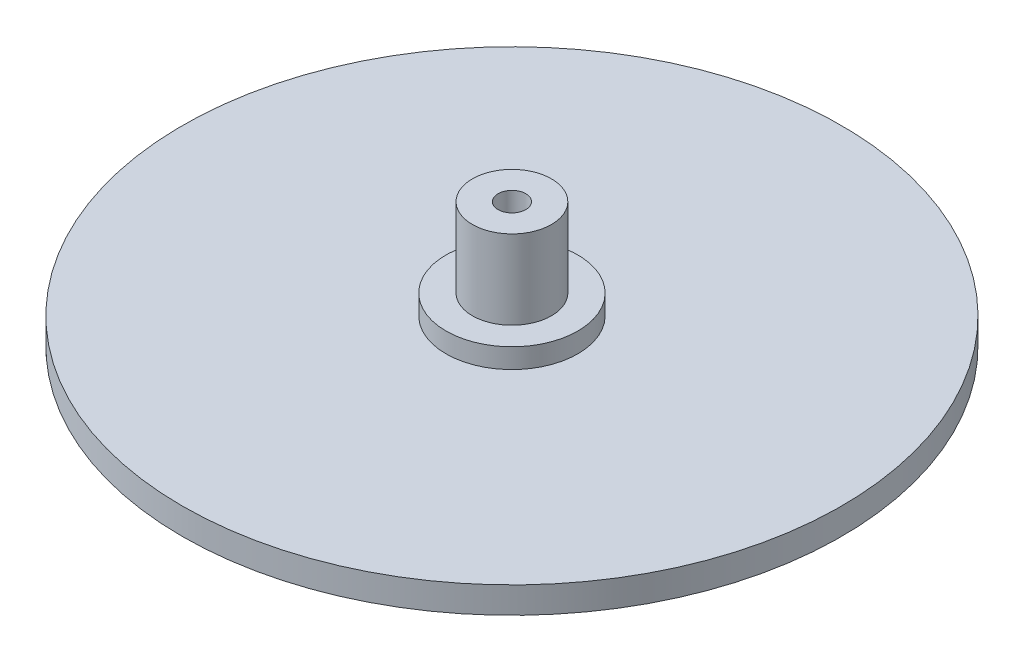
ISO-10303-21;
HEADER;
FILE_DESCRIPTION(('STEP AP214'),'2;1');
FILE_NAME('part.step','',(''),(''),'','','');
FILE_SCHEMA(('AUTOMOTIVE_DESIGN { 1 0 10303 214 1 1 1 1 }'));
ENDSEC;
DATA;
#1=APPLICATION_CONTEXT('core data for automotive mechanical design processes');
#2=APPLICATION_PROTOCOL_DEFINITION('international standard','automotive_design',2000,#1);
#3=PRODUCT_CONTEXT('',#1,'mechanical');
#4=PRODUCT('Part','Part','',(#3));
#5=PRODUCT_RELATED_PRODUCT_CATEGORY('part','',(#4));
#6=PRODUCT_DEFINITION_FORMATION('','',#4);
#7=PRODUCT_DEFINITION_CONTEXT('part definition',#1,'design');
#8=PRODUCT_DEFINITION('design','',#6,#7);
#9=PRODUCT_DEFINITION_SHAPE('','',#8);
#10=(LENGTH_UNIT() NAMED_UNIT(*) SI_UNIT(.MILLI.,.METRE.));
#11=(NAMED_UNIT(*) PLANE_ANGLE_UNIT() SI_UNIT($,.RADIAN.));
#12=(NAMED_UNIT(*) SI_UNIT($,.STERADIAN.) SOLID_ANGLE_UNIT());
#13=UNCERTAINTY_MEASURE_WITH_UNIT(LENGTH_MEASURE(1.E-05),#10,'distance_accuracy_value','');
#14=(GEOMETRIC_REPRESENTATION_CONTEXT(3) GLOBAL_UNCERTAINTY_ASSIGNED_CONTEXT((#13)) GLOBAL_UNIT_ASSIGNED_CONTEXT((#10,
#11,#12)) REPRESENTATION_CONTEXT('',''));
#15=CARTESIAN_POINT('',(0.,0.,0.));
#16=DIRECTION('',(0.,0.,1.));
#17=DIRECTION('',(1.,0.,0.));
#18=AXIS2_PLACEMENT_3D('',#15,#16,#17);
#19=CARTESIAN_POINT('',(0.,2.,0.));
#20=DIRECTION('',(0.,-1.,0.));
#21=DIRECTION('',(0.,0.,-1.));
#22=AXIS2_PLACEMENT_3D('',#19,#20,#21);
#23=CYLINDRICAL_SURFACE('',#22,25.);
#24=CARTESIAN_POINT('',(0.,2.,0.));
#25=DIRECTION('',(0.,1.,0.));
#26=DIRECTION('',(0.,0.,1.));
#27=AXIS2_PLACEMENT_3D('',#24,#25,#26);
#28=CIRCLE('',#27,25.);
#29=CARTESIAN_POINT('',(0.,2.,25.));
#30=VERTEX_POINT('',#29);
#31=EDGE_CURVE('E60',#30,#30,#28,.T.);
#32=ORIENTED_EDGE('',*,*,#31,.F.);
#33=EDGE_LOOP('',(#32));
#34=FACE_BOUND('',#33,.T.);
#35=CARTESIAN_POINT('',(0.,0.,0.));
#36=DIRECTION('',(0.,1.,0.));
#37=DIRECTION('',(0.,0.,1.));
#38=AXIS2_PLACEMENT_3D('',#35,#36,#37);
#39=CIRCLE('',#38,25.);
#40=CARTESIAN_POINT('',(0.,0.,25.));
#41=VERTEX_POINT('',#40);
#42=EDGE_CURVE('E46',#41,#41,#39,.T.);
#43=ORIENTED_EDGE('',*,*,#42,.T.);
#44=EDGE_LOOP('',(#43));
#45=FACE_BOUND('',#44,.T.);
#46=ADVANCED_FACE('F43',(#34,#45),#23,.T.);
#47=CARTESIAN_POINT('',(0.,2.,0.));
#48=DIRECTION('',(0.,1.,0.));
#49=DIRECTION('',(0.,0.,1.));
#50=AXIS2_PLACEMENT_3D('',#47,#48,#49);
#51=PLANE('',#50);
#52=CARTESIAN_POINT('',(0.,2.,0.));
#53=DIRECTION('',(0.,1.,0.));
#54=DIRECTION('',(0.,0.,1.));
#55=AXIS2_PLACEMENT_3D('',#52,#53,#54);
#56=CIRCLE('',#55,5.);
#57=CARTESIAN_POINT('',(0.,2.,5.));
#58=VERTEX_POINT('',#57);
#59=EDGE_CURVE('E51',#58,#58,#56,.T.);
#60=ORIENTED_EDGE('',*,*,#59,.F.);
#61=EDGE_LOOP('',(#60));
#62=FACE_BOUND('',#61,.T.);
#63=ORIENTED_EDGE('',*,*,#31,.T.);
#64=EDGE_LOOP('',(#63));
#65=FACE_BOUND('',#64,.T.);
#66=ADVANCED_FACE('F76',(#62,#65),#51,.T.);
#67=CARTESIAN_POINT('',(0.,0.,0.));
#68=DIRECTION('',(0.,1.,0.));
#69=DIRECTION('',(0.,0.,1.));
#70=AXIS2_PLACEMENT_3D('',#67,#68,#69);
#71=PLANE('',#70);
#72=ORIENTED_EDGE('',*,*,#42,.F.);
#73=EDGE_LOOP('',(#72));
#74=FACE_BOUND('',#73,.T.);
#75=ADVANCED_FACE('F73',(#74),#71,.F.);
#76=CARTESIAN_POINT('',(0.,3.5,0.));
#77=DIRECTION('',(0.,-1.,0.));
#78=DIRECTION('',(0.,0.,-1.));
#79=AXIS2_PLACEMENT_3D('',#76,#77,#78);
#80=CYLINDRICAL_SURFACE('',#79,5.);
#81=CARTESIAN_POINT('',(0.,3.5,0.));
#82=DIRECTION('',(0.,1.,0.));
#83=DIRECTION('',(0.,0.,1.));
#84=AXIS2_PLACEMENT_3D('',#81,#82,#83);
#85=CIRCLE('',#84,5.);
#86=CARTESIAN_POINT('',(0.,3.5,5.));
#87=VERTEX_POINT('',#86);
#88=EDGE_CURVE('E61',#87,#87,#85,.T.);
#89=ORIENTED_EDGE('',*,*,#88,.F.);
#90=EDGE_LOOP('',(#89));
#91=FACE_BOUND('',#90,.T.);
#92=ORIENTED_EDGE('',*,*,#59,.T.);
#93=EDGE_LOOP('',(#92));
#94=FACE_BOUND('',#93,.T.);
#95=ADVANCED_FACE('F80',(#91,#94),#80,.T.);
#96=CARTESIAN_POINT('',(0.,3.5,0.));
#97=DIRECTION('',(0.,1.,0.));
#98=DIRECTION('',(0.,0.,1.));
#99=AXIS2_PLACEMENT_3D('',#96,#97,#98);
#100=PLANE('',#99);
#101=CARTESIAN_POINT('',(0.,3.5,0.));
#102=DIRECTION('',(0.,1.,0.));
#103=DIRECTION('',(0.,0.,1.));
#104=AXIS2_PLACEMENT_3D('',#101,#102,#103);
#105=CIRCLE('',#104,3.);
#106=CARTESIAN_POINT('',(0.,3.5,3.));
#107=VERTEX_POINT('',#106);
#108=EDGE_CURVE('E10',#107,#107,#105,.T.);
#109=ORIENTED_EDGE('',*,*,#108,.F.);
#110=EDGE_LOOP('',(#109));
#111=FACE_BOUND('',#110,.T.);
#112=ORIENTED_EDGE('',*,*,#88,.T.);
#113=EDGE_LOOP('',(#112));
#114=FACE_BOUND('',#113,.T.);
#115=ADVANCED_FACE('F81',(#111,#114),#100,.T.);
#116=CARTESIAN_POINT('',(0.,9.5,0.));
#117=DIRECTION('',(0.,-1.,0.));
#118=DIRECTION('',(0.,0.,-1.));
#119=AXIS2_PLACEMENT_3D('',#116,#117,#118);
#120=CYLINDRICAL_SURFACE('',#119,3.);
#121=CARTESIAN_POINT('',(0.,9.5,0.));
#122=DIRECTION('',(0.,1.,0.));
#123=DIRECTION('',(0.,0.,1.));
#124=AXIS2_PLACEMENT_3D('',#121,#122,#123);
#125=CIRCLE('',#124,3.);
#126=CARTESIAN_POINT('',(0.,9.5,3.));
#127=VERTEX_POINT('',#126);
#128=EDGE_CURVE('E63',#127,#127,#125,.T.);
#129=ORIENTED_EDGE('',*,*,#128,.F.);
#130=EDGE_LOOP('',(#129));
#131=FACE_BOUND('',#130,.T.);
#132=ORIENTED_EDGE('',*,*,#108,.T.);
#133=EDGE_LOOP('',(#132));
#134=FACE_BOUND('',#133,.T.);
#135=ADVANCED_FACE('F116',(#131,#134),#120,.T.);
#136=CARTESIAN_POINT('',(0.,9.5,0.));
#137=DIRECTION('',(0.,1.,0.));
#138=DIRECTION('',(0.,0.,1.));
#139=AXIS2_PLACEMENT_3D('',#136,#137,#138);
#140=PLANE('',#139);
#141=CARTESIAN_POINT('',(0.,9.5,0.));
#142=DIRECTION('',(0.,1.,0.));
#143=DIRECTION('',(0.,0.,1.));
#144=AXIS2_PLACEMENT_3D('',#141,#142,#143);
#145=CIRCLE('',#144,1.05);
#146=CARTESIAN_POINT('',(0.,9.5,1.05));
#147=VERTEX_POINT('',#146);
#148=EDGE_CURVE('E164',#147,#147,#145,.T.);
#149=ORIENTED_EDGE('',*,*,#148,.F.);
#150=EDGE_LOOP('',(#149));
#151=FACE_BOUND('',#150,.T.);
#152=ORIENTED_EDGE('',*,*,#128,.T.);
#153=EDGE_LOOP('',(#152));
#154=FACE_BOUND('',#153,.T.);
#155=ADVANCED_FACE('F126',(#151,#154),#140,.T.);
#156=CARTESIAN_POINT('',(0.,0.5,0.));
#157=DIRECTION('',(0.,1.,0.));
#158=DIRECTION('',(0.,0.,1.));
#159=AXIS2_PLACEMENT_3D('',#156,#157,#158);
#160=CYLINDRICAL_SURFACE('',#159,1.05);
#161=CARTESIAN_POINT('',(0.,0.5,0.));
#162=DIRECTION('',(0.,1.,0.));
#163=DIRECTION('',(0.,0.,1.));
#164=AXIS2_PLACEMENT_3D('',#161,#162,#163);
#165=CIRCLE('',#164,1.05);
#166=CARTESIAN_POINT('',(0.,0.5,1.05));
#167=VERTEX_POINT('',#166);
#168=EDGE_CURVE('E162',#167,#167,#165,.T.);
#169=ORIENTED_EDGE('',*,*,#168,.F.);
#170=EDGE_LOOP('',(#169));
#171=FACE_BOUND('',#170,.T.);
#172=ORIENTED_EDGE('',*,*,#148,.T.);
#173=EDGE_LOOP('',(#172));
#174=FACE_BOUND('',#173,.T.);
#175=ADVANCED_FACE('F139',(#171,#174),#160,.F.);
#176=CARTESIAN_POINT('',(0.,0.5,0.));
#177=DIRECTION('',(0.,1.,0.));
#178=DIRECTION('',(0.,0.,1.));
#179=AXIS2_PLACEMENT_3D('',#176,#177,#178);
#180=PLANE('',#179);
#181=ORIENTED_EDGE('',*,*,#168,.T.);
#182=EDGE_LOOP('',(#181));
#183=FACE_BOUND('',#182,.T.);
#184=ADVANCED_FACE('F146',(#183),#180,.T.);
#185=CLOSED_SHELL('',(#46,#66,#75,#95,#115,#135,#155,#175,#184));
#186=MANIFOLD_SOLID_BREP('B2',#185);
#187=ADVANCED_BREP_SHAPE_REPRESENTATION('',(#18,#186),#14);
#188=SHAPE_DEFINITION_REPRESENTATION(#9,#187);
ENDSEC;
END-ISO-10303-21;
